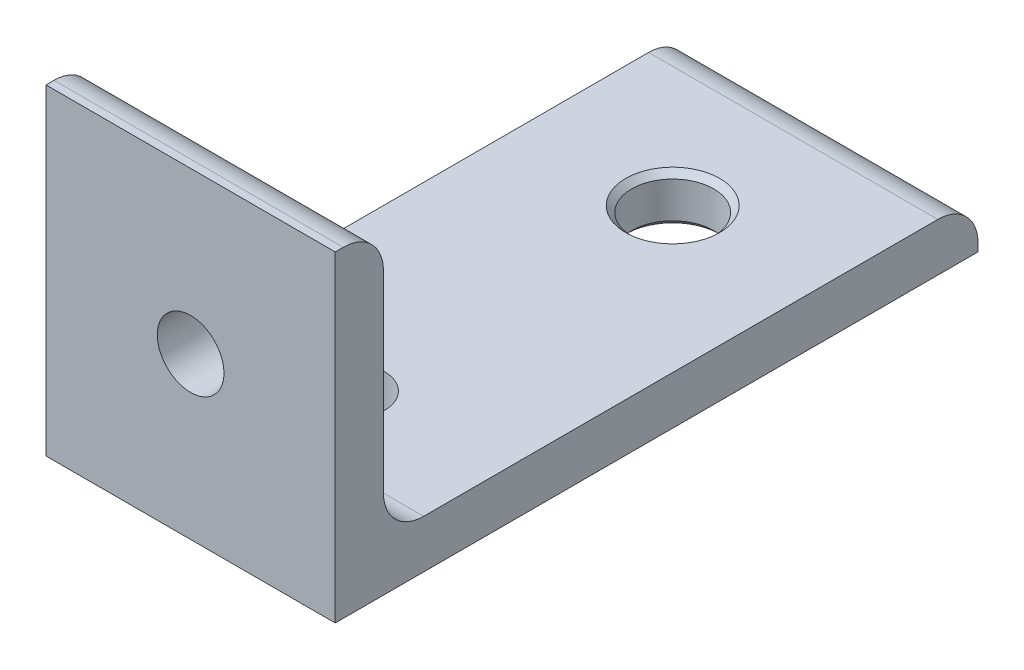
ISO-10303-21;
HEADER;
FILE_DESCRIPTION(('STEP AP214'),'2;1');
FILE_NAME('part.step','',(''),(''),'','','');
FILE_SCHEMA(('AUTOMOTIVE_DESIGN { 1 0 10303 214 1 1 1 1 }'));
ENDSEC;
DATA;
#1=APPLICATION_CONTEXT('core data for automotive mechanical design processes');
#2=APPLICATION_PROTOCOL_DEFINITION('international standard','automotive_design',2000,#1);
#3=PRODUCT_CONTEXT('',#1,'mechanical');
#4=PRODUCT('Part','Part','',(#3));
#5=PRODUCT_RELATED_PRODUCT_CATEGORY('part','',(#4));
#6=PRODUCT_DEFINITION_FORMATION('','',#4);
#7=PRODUCT_DEFINITION_CONTEXT('part definition',#1,'design');
#8=PRODUCT_DEFINITION('design','',#6,#7);
#9=PRODUCT_DEFINITION_SHAPE('','',#8);
#10=(LENGTH_UNIT() NAMED_UNIT(*) SI_UNIT(.MILLI.,.METRE.));
#11=(NAMED_UNIT(*) PLANE_ANGLE_UNIT() SI_UNIT($,.RADIAN.));
#12=(NAMED_UNIT(*) SI_UNIT($,.STERADIAN.) SOLID_ANGLE_UNIT());
#13=UNCERTAINTY_MEASURE_WITH_UNIT(LENGTH_MEASURE(1.E-05),#10,'distance_accuracy_value','');
#14=(GEOMETRIC_REPRESENTATION_CONTEXT(3) GLOBAL_UNCERTAINTY_ASSIGNED_CONTEXT((#13)) GLOBAL_UNIT_ASSIGNED_CONTEXT((#10,
#11,#12)) REPRESENTATION_CONTEXT('',''));
#15=CARTESIAN_POINT('',(0.,0.,0.));
#16=DIRECTION('',(0.,0.,1.));
#17=DIRECTION('',(1.,0.,0.));
#18=AXIS2_PLACEMENT_3D('',#15,#16,#17);
#19=CARTESIAN_POINT('',(18.,40.,0.));
#20=DIRECTION('',(0.,-1.,0.));
#21=DIRECTION('',(0.,0.,-1.));
#22=AXIS2_PLACEMENT_3D('',#19,#20,#21);
#23=PLANE('',#22);
#24=DIRECTION('',(0.,0.,1.));
#25=VECTOR('',#24,1.);
#26=CARTESIAN_POINT('',(18.,40.,0.));
#27=LINE('',#26,#25);
#28=CARTESIAN_POINT('',(18.,40.,-1.));
#29=VERTEX_POINT('',#28);
#30=CARTESIAN_POINT('',(18.,40.,0.));
#31=VERTEX_POINT('',#30);
#32=EDGE_CURVE('E114',#29,#31,#27,.T.);
#33=ORIENTED_EDGE('',*,*,#32,.F.);
#34=DIRECTION('',(-1.,0.,0.));
#35=VECTOR('',#34,1.);
#36=CARTESIAN_POINT('',(18.,40.,-1.));
#37=LINE('',#36,#35);
#38=CARTESIAN_POINT('',(-18.,40.,-1.));
#39=VERTEX_POINT('',#38);
#40=EDGE_CURVE('E163',#29,#39,#37,.T.);
#41=ORIENTED_EDGE('',*,*,#40,.T.);
#42=DIRECTION('',(0.,0.,1.));
#43=VECTOR('',#42,1.);
#44=CARTESIAN_POINT('',(-18.,40.,0.));
#45=LINE('',#44,#43);
#46=CARTESIAN_POINT('',(-18.,40.,0.));
#47=VERTEX_POINT('',#46);
#48=EDGE_CURVE('E140',#39,#47,#45,.T.);
#49=ORIENTED_EDGE('',*,*,#48,.T.);
#50=DIRECTION('',(-1.,0.,0.));
#51=VECTOR('',#50,1.);
#52=CARTESIAN_POINT('',(18.,40.,0.));
#53=LINE('',#52,#51);
#54=EDGE_CURVE('E132',#31,#47,#53,.T.);
#55=ORIENTED_EDGE('',*,*,#54,.F.);
#56=EDGE_LOOP('',(#33,#41,#49,#55));
#57=FACE_BOUND('',#56,.T.);
#58=ADVANCED_FACE('F41',(#57),#23,.F.);
#59=CARTESIAN_POINT('',(18.,40.,0.));
#60=DIRECTION('',(0.,0.,-1.));
#61=DIRECTION('',(-1.,0.,0.));
#62=AXIS2_PLACEMENT_3D('',#59,#60,#61);
#63=PLANE('',#62);
#64=CARTESIAN_POINT('',(0.,20.,0.));
#65=DIRECTION('',(0.,0.,-1.));
#66=DIRECTION('',(-1.,0.,0.));
#67=AXIS2_PLACEMENT_3D('',#64,#65,#66);
#68=CIRCLE('',#67,4.15);
#69=CARTESIAN_POINT('',(-4.15,20.,0.));
#70=VERTEX_POINT('',#69);
#71=EDGE_CURVE('E262',#70,#70,#68,.T.);
#72=ORIENTED_EDGE('',*,*,#71,.T.);
#73=EDGE_LOOP('',(#72));
#74=FACE_BOUND('',#73,.T.);
#75=DIRECTION('',(0.,-1.,0.));
#76=VECTOR('',#75,1.);
#77=CARTESIAN_POINT('',(-18.,40.,0.));
#78=LINE('',#77,#76);
#79=CARTESIAN_POINT('',(-18.,0.,0.));
#80=VERTEX_POINT('',#79);
#81=EDGE_CURVE('E219',#47,#80,#78,.T.);
#82=ORIENTED_EDGE('',*,*,#81,.T.);
#83=DIRECTION('',(-1.,0.,0.));
#84=VECTOR('',#83,1.);
#85=CARTESIAN_POINT('',(18.,0.,0.));
#86=LINE('',#85,#84);
#87=CARTESIAN_POINT('',(18.,0.,0.));
#88=VERTEX_POINT('',#87);
#89=EDGE_CURVE('E134',#88,#80,#86,.T.);
#90=ORIENTED_EDGE('',*,*,#89,.F.);
#91=DIRECTION('',(0.,-1.,0.));
#92=VECTOR('',#91,1.);
#93=CARTESIAN_POINT('',(18.,40.,0.));
#94=LINE('',#93,#92);
#95=EDGE_CURVE('E118',#31,#88,#94,.T.);
#96=ORIENTED_EDGE('',*,*,#95,.F.);
#97=ORIENTED_EDGE('',*,*,#54,.T.);
#98=EDGE_LOOP('',(#82,#90,#96,#97));
#99=FACE_BOUND('',#98,.T.);
#100=ADVANCED_FACE('F131',(#74,#99),#63,.F.);
#101=CARTESIAN_POINT('',(18.,0.,0.));
#102=DIRECTION('',(0.,1.,0.));
#103=DIRECTION('',(0.,0.,1.));
#104=AXIS2_PLACEMENT_3D('',#101,#102,#103);
#105=PLANE('',#104);
#106=CARTESIAN_POINT('',(0.,0.,-60.));
#107=DIRECTION('',(0.,1.,0.));
#108=DIRECTION('',(0.,0.,1.));
#109=AXIS2_PLACEMENT_3D('',#106,#107,#108);
#110=CIRCLE('',#109,5.85);
#111=CARTESIAN_POINT('',(0.,0.,-54.15));
#112=VERTEX_POINT('',#111);
#113=EDGE_CURVE('E184',#112,#112,#110,.T.);
#114=ORIENTED_EDGE('',*,*,#113,.T.);
#115=EDGE_LOOP('',(#114));
#116=FACE_BOUND('',#115,.T.);
#117=CARTESIAN_POINT('',(0.,0.,-20.));
#118=DIRECTION('',(0.,1.,0.));
#119=DIRECTION('',(0.,0.,1.));
#120=AXIS2_PLACEMENT_3D('',#117,#118,#119);
#121=CIRCLE('',#120,4.15);
#122=CARTESIAN_POINT('',(0.,0.,-15.85));
#123=VERTEX_POINT('',#122);
#124=EDGE_CURVE('E212',#123,#123,#121,.T.);
#125=ORIENTED_EDGE('',*,*,#124,.T.);
#126=EDGE_LOOP('',(#125));
#127=FACE_BOUND('',#126,.T.);
#128=DIRECTION('',(0.,0.,-1.));
#129=VECTOR('',#128,1.);
#130=CARTESIAN_POINT('',(-18.,0.,0.));
#131=LINE('',#130,#129);
#132=CARTESIAN_POINT('',(-18.,0.,-80.));
#133=VERTEX_POINT('',#132);
#134=EDGE_CURVE('E215',#80,#133,#131,.T.);
#135=ORIENTED_EDGE('',*,*,#134,.T.);
#136=DIRECTION('',(-1.,0.,0.));
#137=VECTOR('',#136,1.);
#138=CARTESIAN_POINT('',(18.,0.,-80.));
#139=LINE('',#138,#137);
#140=CARTESIAN_POINT('',(18.,0.,-80.));
#141=VERTEX_POINT('',#140);
#142=EDGE_CURVE('E149',#141,#133,#139,.T.);
#143=ORIENTED_EDGE('',*,*,#142,.F.);
#144=DIRECTION('',(0.,0.,-1.));
#145=VECTOR('',#144,1.);
#146=CARTESIAN_POINT('',(18.,0.,0.));
#147=LINE('',#146,#145);
#148=EDGE_CURVE('E137',#88,#141,#147,.T.);
#149=ORIENTED_EDGE('',*,*,#148,.F.);
#150=ORIENTED_EDGE('',*,*,#89,.T.);
#151=EDGE_LOOP('',(#135,#143,#149,#150));
#152=FACE_BOUND('',#151,.T.);
#153=ADVANCED_FACE('F204',(#116,#127,#152),#105,.F.);
#154=CARTESIAN_POINT('',(18.,6.,-80.));
#155=DIRECTION('',(0.,0.,1.));
#156=DIRECTION('',(1.,0.,0.));
#157=AXIS2_PLACEMENT_3D('',#154,#155,#156);
#158=PLANE('',#157);
#159=DIRECTION('',(0.,1.,0.));
#160=VECTOR('',#159,1.);
#161=CARTESIAN_POINT('',(-18.,6.,-80.));
#162=LINE('',#161,#160);
#163=CARTESIAN_POINT('',(-18.,1.,-80.));
#164=VERTEX_POINT('',#163);
#165=EDGE_CURVE('E218',#133,#164,#162,.T.);
#166=ORIENTED_EDGE('',*,*,#165,.T.);
#167=DIRECTION('',(-1.,0.,0.));
#168=VECTOR('',#167,1.);
#169=CARTESIAN_POINT('',(18.,1.,-80.));
#170=LINE('',#169,#168);
#171=CARTESIAN_POINT('',(18.,1.,-80.));
#172=VERTEX_POINT('',#171);
#173=EDGE_CURVE('E57',#164,#172,#170,.F.);
#174=ORIENTED_EDGE('',*,*,#173,.T.);
#175=DIRECTION('',(0.,1.,0.));
#176=VECTOR('',#175,1.);
#177=CARTESIAN_POINT('',(18.,6.,-80.));
#178=LINE('',#177,#176);
#179=EDGE_CURVE('E221',#141,#172,#178,.T.);
#180=ORIENTED_EDGE('',*,*,#179,.F.);
#181=ORIENTED_EDGE('',*,*,#142,.T.);
#182=EDGE_LOOP('',(#166,#174,#180,#181));
#183=FACE_BOUND('',#182,.T.);
#184=ADVANCED_FACE('F207',(#183),#158,.F.);
#185=CARTESIAN_POINT('',(18.,6.,-6.));
#186=DIRECTION('',(0.,-1.,0.));
#187=DIRECTION('',(0.,0.,-1.));
#188=AXIS2_PLACEMENT_3D('',#185,#186,#187);
#189=PLANE('',#188);
#190=CARTESIAN_POINT('',(0.,6.,-60.));
#191=DIRECTION('',(0.,-1.,0.));
#192=DIRECTION('',(0.,0.,-1.));
#193=AXIS2_PLACEMENT_3D('',#190,#191,#192);
#194=CIRCLE('',#193,5.85000000000001);
#195=CARTESIAN_POINT('',(0.,6.,-65.85));
#196=VERTEX_POINT('',#195);
#197=EDGE_CURVE('E11',#196,#196,#194,.T.);
#198=ORIENTED_EDGE('',*,*,#197,.T.);
#199=EDGE_LOOP('',(#198));
#200=FACE_BOUND('',#199,.T.);
#201=CARTESIAN_POINT('',(0.,6.,-20.));
#202=DIRECTION('',(0.,1.,0.));
#203=DIRECTION('',(0.,0.,1.));
#204=AXIS2_PLACEMENT_3D('',#201,#202,#203);
#205=CIRCLE('',#204,4.15);
#206=CARTESIAN_POINT('',(0.,6.,-15.85));
#207=VERTEX_POINT('',#206);
#208=EDGE_CURVE('E244',#207,#207,#205,.T.);
#209=ORIENTED_EDGE('',*,*,#208,.F.);
#210=EDGE_LOOP('',(#209));
#211=FACE_BOUND('',#210,.T.);
#212=DIRECTION('',(0.,0.,1.));
#213=VECTOR('',#212,1.);
#214=CARTESIAN_POINT('',(-18.,6.,-6.));
#215=LINE('',#214,#213);
#216=CARTESIAN_POINT('',(-18.,6.,-75.));
#217=VERTEX_POINT('',#216);
#218=CARTESIAN_POINT('',(-18.,6.,-11.));
#219=VERTEX_POINT('',#218);
#220=EDGE_CURVE('E226',#217,#219,#215,.T.);
#221=ORIENTED_EDGE('',*,*,#220,.T.);
#222=DIRECTION('',(-1.,0.,0.));
#223=VECTOR('',#222,1.);
#224=CARTESIAN_POINT('',(18.,6.,-11.));
#225=LINE('',#224,#223);
#226=CARTESIAN_POINT('',(18.,6.,-11.));
#227=VERTEX_POINT('',#226);
#228=EDGE_CURVE('E160',#219,#227,#225,.F.);
#229=ORIENTED_EDGE('',*,*,#228,.T.);
#230=DIRECTION('',(0.,0.,1.));
#231=VECTOR('',#230,1.);
#232=CARTESIAN_POINT('',(18.,6.,-6.));
#233=LINE('',#232,#231);
#234=CARTESIAN_POINT('',(18.,6.,-75.));
#235=VERTEX_POINT('',#234);
#236=EDGE_CURVE('E253',#235,#227,#233,.T.);
#237=ORIENTED_EDGE('',*,*,#236,.F.);
#238=DIRECTION('',(-1.,0.,0.));
#239=VECTOR('',#238,1.);
#240=CARTESIAN_POINT('',(18.,6.,-75.));
#241=LINE('',#240,#239);
#242=EDGE_CURVE('E156',#235,#217,#241,.T.);
#243=ORIENTED_EDGE('',*,*,#242,.T.);
#244=EDGE_LOOP('',(#221,#229,#237,#243));
#245=FACE_BOUND('',#244,.T.);
#246=ADVANCED_FACE('F281',(#200,#211,#245),#189,.F.);
#247=CARTESIAN_POINT('',(18.,40.,-6.));
#248=DIRECTION('',(0.,0.,1.));
#249=DIRECTION('',(1.,0.,0.));
#250=AXIS2_PLACEMENT_3D('',#247,#248,#249);
#251=PLANE('',#250);
#252=CARTESIAN_POINT('',(0.,20.,-6.));
#253=DIRECTION('',(0.,0.,-1.));
#254=DIRECTION('',(-1.,0.,0.));
#255=AXIS2_PLACEMENT_3D('',#252,#253,#254);
#256=CIRCLE('',#255,4.15);
#257=CARTESIAN_POINT('',(-4.15,20.,-6.));
#258=VERTEX_POINT('',#257);
#259=EDGE_CURVE('E264',#258,#258,#256,.T.);
#260=ORIENTED_EDGE('',*,*,#259,.F.);
#261=EDGE_LOOP('',(#260));
#262=FACE_BOUND('',#261,.T.);
#263=DIRECTION('',(0.,1.,0.));
#264=VECTOR('',#263,1.);
#265=CARTESIAN_POINT('',(18.,40.,-6.));
#266=LINE('',#265,#264);
#267=CARTESIAN_POINT('',(18.,11.,-6.));
#268=VERTEX_POINT('',#267);
#269=CARTESIAN_POINT('',(18.,35.,-6.));
#270=VERTEX_POINT('',#269);
#271=EDGE_CURVE('E223',#268,#270,#266,.T.);
#272=ORIENTED_EDGE('',*,*,#271,.F.);
#273=DIRECTION('',(-1.,0.,0.));
#274=VECTOR('',#273,1.);
#275=CARTESIAN_POINT('',(-18.,11.,-6.));
#276=LINE('',#275,#274);
#277=CARTESIAN_POINT('',(-18.,11.,-6.));
#278=VERTEX_POINT('',#277);
#279=EDGE_CURVE('E147',#268,#278,#276,.T.);
#280=ORIENTED_EDGE('',*,*,#279,.T.);
#281=DIRECTION('',(0.,1.,0.));
#282=VECTOR('',#281,1.);
#283=CARTESIAN_POINT('',(-18.,40.,-6.));
#284=LINE('',#283,#282);
#285=CARTESIAN_POINT('',(-18.,35.,-6.));
#286=VERTEX_POINT('',#285);
#287=EDGE_CURVE('E127',#278,#286,#284,.T.);
#288=ORIENTED_EDGE('',*,*,#287,.T.);
#289=DIRECTION('',(-1.,0.,0.));
#290=VECTOR('',#289,1.);
#291=CARTESIAN_POINT('',(18.,35.,-6.));
#292=LINE('',#291,#290);
#293=EDGE_CURVE('E143',#286,#270,#292,.F.);
#294=ORIENTED_EDGE('',*,*,#293,.T.);
#295=EDGE_LOOP('',(#272,#280,#288,#294));
#296=FACE_BOUND('',#295,.T.);
#297=ADVANCED_FACE('F239',(#262,#296),#251,.F.);
#298=CARTESIAN_POINT('',(18.,0.,0.));
#299=DIRECTION('',(-1.,0.,0.));
#300=DIRECTION('',(0.,0.,1.));
#301=AXIS2_PLACEMENT_3D('',#298,#299,#300);
#302=PLANE('',#301);
#303=ORIENTED_EDGE('',*,*,#271,.T.);
#304=CARTESIAN_POINT('',(18.,35.,-1.));
#305=DIRECTION('',(-1.,0.,0.));
#306=DIRECTION('',(0.,0.,1.));
#307=AXIS2_PLACEMENT_3D('',#304,#305,#306);
#308=CIRCLE('',#307,5.);
#309=EDGE_CURVE('E121',#270,#29,#308,.F.);
#310=ORIENTED_EDGE('',*,*,#309,.T.);
#311=ORIENTED_EDGE('',*,*,#32,.T.);
#312=ORIENTED_EDGE('',*,*,#95,.T.);
#313=ORIENTED_EDGE('',*,*,#148,.T.);
#314=ORIENTED_EDGE('',*,*,#179,.T.);
#315=CARTESIAN_POINT('',(18.,1.,-75.));
#316=DIRECTION('',(-1.,0.,0.));
#317=DIRECTION('',(0.,0.,1.));
#318=AXIS2_PLACEMENT_3D('',#315,#316,#317);
#319=CIRCLE('',#318,5.);
#320=EDGE_CURVE('E171',#172,#235,#319,.F.);
#321=ORIENTED_EDGE('',*,*,#320,.T.);
#322=ORIENTED_EDGE('',*,*,#236,.T.);
#323=CARTESIAN_POINT('',(18.,11.,-11.));
#324=DIRECTION('',(-1.,0.,0.));
#325=DIRECTION('',(0.,0.,1.));
#326=AXIS2_PLACEMENT_3D('',#323,#324,#325);
#327=CIRCLE('',#326,5.);
#328=EDGE_CURVE('E181',#227,#268,#327,.T.);
#329=ORIENTED_EDGE('',*,*,#328,.T.);
#330=EDGE_LOOP('',(#303,#310,#311,#312,#313,#314,#321,#322,#329));
#331=FACE_BOUND('',#330,.T.);
#332=ADVANCED_FACE('F117',(#331),#302,.F.);
#333=CARTESIAN_POINT('',(-18.,0.,0.));
#334=DIRECTION('',(-1.,0.,0.));
#335=DIRECTION('',(0.,0.,1.));
#336=AXIS2_PLACEMENT_3D('',#333,#334,#335);
#337=PLANE('',#336);
#338=ORIENTED_EDGE('',*,*,#48,.F.);
#339=CARTESIAN_POINT('',(-18.,35.,-1.));
#340=DIRECTION('',(-1.,0.,0.));
#341=DIRECTION('',(0.,0.,1.));
#342=AXIS2_PLACEMENT_3D('',#339,#340,#341);
#343=CIRCLE('',#342,5.);
#344=EDGE_CURVE('E168',#39,#286,#343,.T.);
#345=ORIENTED_EDGE('',*,*,#344,.T.);
#346=ORIENTED_EDGE('',*,*,#287,.F.);
#347=CARTESIAN_POINT('',(-18.,11.,-11.));
#348=DIRECTION('',(-1.,0.,0.));
#349=DIRECTION('',(0.,0.,1.));
#350=AXIS2_PLACEMENT_3D('',#347,#348,#349);
#351=CIRCLE('',#350,5.);
#352=EDGE_CURVE('E178',#278,#219,#351,.F.);
#353=ORIENTED_EDGE('',*,*,#352,.T.);
#354=ORIENTED_EDGE('',*,*,#220,.F.);
#355=CARTESIAN_POINT('',(-18.,1.,-75.));
#356=DIRECTION('',(-1.,0.,0.));
#357=DIRECTION('',(0.,0.,1.));
#358=AXIS2_PLACEMENT_3D('',#355,#356,#357);
#359=CIRCLE('',#358,5.);
#360=EDGE_CURVE('E65',#217,#164,#359,.T.);
#361=ORIENTED_EDGE('',*,*,#360,.T.);
#362=ORIENTED_EDGE('',*,*,#165,.F.);
#363=ORIENTED_EDGE('',*,*,#134,.F.);
#364=ORIENTED_EDGE('',*,*,#81,.F.);
#365=EDGE_LOOP('',(#338,#345,#346,#353,#354,#361,#362,#363,#364));
#366=FACE_BOUND('',#365,.T.);
#367=ADVANCED_FACE('F224',(#366),#337,.T.);
#368=CARTESIAN_POINT('',(0.,0.,-20.));
#369=DIRECTION('',(0.,1.,0.));
#370=DIRECTION('',(0.,0.,1.));
#371=AXIS2_PLACEMENT_3D('',#368,#369,#370);
#372=CYLINDRICAL_SURFACE('',#371,4.15);
#373=ORIENTED_EDGE('',*,*,#124,.F.);
#374=EDGE_LOOP('',(#373));
#375=FACE_BOUND('',#374,.T.);
#376=ORIENTED_EDGE('',*,*,#208,.T.);
#377=EDGE_LOOP('',(#376));
#378=FACE_BOUND('',#377,.T.);
#379=ADVANCED_FACE('F339',(#375,#378),#372,.F.);
#380=CARTESIAN_POINT('',(0.,0.,-60.));
#381=DIRECTION('',(0.,1.,0.));
#382=DIRECTION('',(0.,0.,1.));
#383=AXIS2_PLACEMENT_3D('',#380,#381,#382);
#384=CYLINDRICAL_SURFACE('',#383,5.1);
#385=CARTESIAN_POINT('',(0.,0.75000000000001,-60.));
#386=DIRECTION('',(0.,1.,0.));
#387=DIRECTION('',(0.,0.,1.));
#388=AXIS2_PLACEMENT_3D('',#385,#386,#387);
#389=CIRCLE('',#388,5.1);
#390=CARTESIAN_POINT('',(0.,0.75000000000001,-54.9));
#391=VERTEX_POINT('',#390);
#392=EDGE_CURVE('E50',#391,#391,#389,.F.);
#393=ORIENTED_EDGE('',*,*,#392,.T.);
#394=EDGE_LOOP('',(#393));
#395=FACE_BOUND('',#394,.T.);
#396=CARTESIAN_POINT('',(0.,5.24999999999998,-60.));
#397=DIRECTION('',(0.,-1.,0.));
#398=DIRECTION('',(0.,0.,-1.));
#399=AXIS2_PLACEMENT_3D('',#396,#397,#398);
#400=CIRCLE('',#399,5.1);
#401=CARTESIAN_POINT('',(0.,5.24999999999998,-65.1));
#402=VERTEX_POINT('',#401);
#403=EDGE_CURVE('E188',#402,#402,#400,.F.);
#404=ORIENTED_EDGE('',*,*,#403,.T.);
#405=EDGE_LOOP('',(#404));
#406=FACE_BOUND('',#405,.T.);
#407=ADVANCED_FACE('F195',(#395,#406),#384,.F.);
#408=CARTESIAN_POINT('',(0.,20.,0.));
#409=DIRECTION('',(0.,0.,-1.));
#410=DIRECTION('',(-1.,0.,0.));
#411=AXIS2_PLACEMENT_3D('',#408,#409,#410);
#412=CYLINDRICAL_SURFACE('',#411,4.15);
#413=ORIENTED_EDGE('',*,*,#71,.F.);
#414=EDGE_LOOP('',(#413));
#415=FACE_BOUND('',#414,.T.);
#416=ORIENTED_EDGE('',*,*,#259,.T.);
#417=EDGE_LOOP('',(#416));
#418=FACE_BOUND('',#417,.T.);
#419=ADVANCED_FACE('F273',(#415,#418),#412,.F.);
#420=CARTESIAN_POINT('',(18.,11.,-11.));
#421=DIRECTION('',(1.,0.,0.));
#422=DIRECTION('',(0.,0.,-1.));
#423=AXIS2_PLACEMENT_3D('',#420,#421,#422);
#424=CYLINDRICAL_SURFACE('',#423,5.);
#425=ORIENTED_EDGE('',*,*,#328,.F.);
#426=ORIENTED_EDGE('',*,*,#228,.F.);
#427=ORIENTED_EDGE('',*,*,#352,.F.);
#428=ORIENTED_EDGE('',*,*,#279,.F.);
#429=EDGE_LOOP('',(#425,#426,#427,#428));
#430=FACE_BOUND('',#429,.T.);
#431=ADVANCED_FACE('F276',(#430),#424,.F.);
#432=CARTESIAN_POINT('',(18.,35.,-1.));
#433=DIRECTION('',(-1.,0.,0.));
#434=DIRECTION('',(0.,0.,1.));
#435=AXIS2_PLACEMENT_3D('',#432,#433,#434);
#436=CYLINDRICAL_SURFACE('',#435,5.);
#437=ORIENTED_EDGE('',*,*,#309,.F.);
#438=ORIENTED_EDGE('',*,*,#293,.F.);
#439=ORIENTED_EDGE('',*,*,#344,.F.);
#440=ORIENTED_EDGE('',*,*,#40,.F.);
#441=EDGE_LOOP('',(#437,#438,#439,#440));
#442=FACE_BOUND('',#441,.T.);
#443=ADVANCED_FACE('F242',(#442),#436,.T.);
#444=CARTESIAN_POINT('',(18.,1.,-75.));
#445=DIRECTION('',(-1.,0.,0.));
#446=DIRECTION('',(0.,0.,1.));
#447=AXIS2_PLACEMENT_3D('',#444,#445,#446);
#448=CYLINDRICAL_SURFACE('',#447,5.);
#449=ORIENTED_EDGE('',*,*,#320,.F.);
#450=ORIENTED_EDGE('',*,*,#173,.F.);
#451=ORIENTED_EDGE('',*,*,#360,.F.);
#452=ORIENTED_EDGE('',*,*,#242,.F.);
#453=EDGE_LOOP('',(#449,#450,#451,#452));
#454=FACE_BOUND('',#453,.T.);
#455=ADVANCED_FACE('F201',(#454),#448,.T.);
#456=CARTESIAN_POINT('',(0.,0.,-60.));
#457=DIRECTION('',(0.,-1.,0.));
#458=DIRECTION('',(0.,0.,-1.));
#459=AXIS2_PLACEMENT_3D('',#456,#457,#458);
#460=CONICAL_SURFACE('',#459,5.85,0.785398163397441);
#461=ORIENTED_EDGE('',*,*,#392,.F.);
#462=EDGE_LOOP('',(#461));
#463=FACE_BOUND('',#462,.T.);
#464=ORIENTED_EDGE('',*,*,#113,.F.);
#465=EDGE_LOOP('',(#464));
#466=FACE_BOUND('',#465,.T.);
#467=ADVANCED_FACE('F198',(#463,#466),#460,.F.);
#468=CARTESIAN_POINT('',(0.,5.24999999999998,-60.));
#469=DIRECTION('',(0.,1.,0.));
#470=DIRECTION('',(0.,0.,1.));
#471=AXIS2_PLACEMENT_3D('',#468,#469,#470);
#472=CONICAL_SURFACE('',#471,5.1,0.785398163397441);
#473=ORIENTED_EDGE('',*,*,#197,.F.);
#474=EDGE_LOOP('',(#473));
#475=FACE_BOUND('',#474,.T.);
#476=ORIENTED_EDGE('',*,*,#403,.F.);
#477=EDGE_LOOP('',(#476));
#478=FACE_BOUND('',#477,.T.);
#479=ADVANCED_FACE('F43',(#475,#478),#472,.F.);
#480=CLOSED_SHELL('',(#58,#100,#153,#184,#246,#297,#332,#367,#379,#407,#419,#431,#443,#455,#467,#479));
#481=MANIFOLD_SOLID_BREP('B2',#480);
#482=ADVANCED_BREP_SHAPE_REPRESENTATION('',(#18,#481),#14);
#483=SHAPE_DEFINITION_REPRESENTATION(#9,#482);
ENDSEC;
END-ISO-10303-21;
